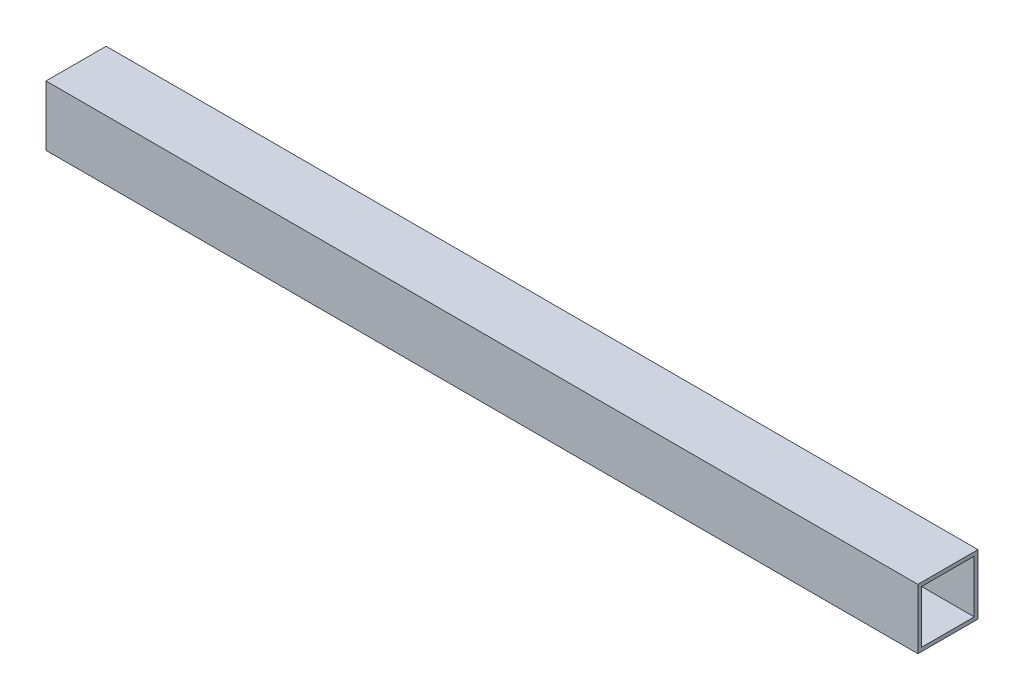
ISO-10303-21;
HEADER;
FILE_DESCRIPTION(('STEP AP214'),'2;1');
FILE_NAME('part.step','',(''),(''),'','','');
FILE_SCHEMA(('AUTOMOTIVE_DESIGN { 1 0 10303 214 1 1 1 1 }'));
ENDSEC;
DATA;
#1=APPLICATION_CONTEXT('core data for automotive mechanical design processes');
#2=APPLICATION_PROTOCOL_DEFINITION('international standard','automotive_design',2000,#1);
#3=PRODUCT_CONTEXT('',#1,'mechanical');
#4=PRODUCT('Part','Part','',(#3));
#5=PRODUCT_RELATED_PRODUCT_CATEGORY('part','',(#4));
#6=PRODUCT_DEFINITION_FORMATION('','',#4);
#7=PRODUCT_DEFINITION_CONTEXT('part definition',#1,'design');
#8=PRODUCT_DEFINITION('design','',#6,#7);
#9=PRODUCT_DEFINITION_SHAPE('','',#8);
#10=(LENGTH_UNIT() NAMED_UNIT(*) SI_UNIT(.MILLI.,.METRE.));
#11=(NAMED_UNIT(*) PLANE_ANGLE_UNIT() SI_UNIT($,.RADIAN.));
#12=(NAMED_UNIT(*) SI_UNIT($,.STERADIAN.) SOLID_ANGLE_UNIT());
#13=UNCERTAINTY_MEASURE_WITH_UNIT(LENGTH_MEASURE(1.E-05),#10,'distance_accuracy_value','');
#14=(GEOMETRIC_REPRESENTATION_CONTEXT(3) GLOBAL_UNCERTAINTY_ASSIGNED_CONTEXT((#13)) GLOBAL_UNIT_ASSIGNED_CONTEXT((#10,
#11,#12)) REPRESENTATION_CONTEXT('',''));
#15=CARTESIAN_POINT('',(0.,0.,0.));
#16=DIRECTION('',(0.,0.,1.));
#17=DIRECTION('',(1.,0.,0.));
#18=AXIS2_PLACEMENT_3D('',#15,#16,#17);
#19=CARTESIAN_POINT('',(368.3,0.,0.));
#20=DIRECTION('',(-1.,0.,0.));
#21=DIRECTION('',(0.,0.,1.));
#22=AXIS2_PLACEMENT_3D('',#19,#20,#21);
#23=PLANE('',#22);
#24=DIRECTION('',(0.,1.,0.));
#25=VECTOR('',#24,1.);
#26=CARTESIAN_POINT('',(368.3,-12.7,-12.7));
#27=LINE('',#26,#25);
#28=CARTESIAN_POINT('',(368.3,-12.7,-12.7));
#29=VERTEX_POINT('',#28);
#30=CARTESIAN_POINT('',(368.3,12.7,-12.7));
#31=VERTEX_POINT('',#30);
#32=EDGE_CURVE('E134',#29,#31,#27,.T.);
#33=ORIENTED_EDGE('',*,*,#32,.T.);
#34=DIRECTION('',(0.,0.,1.));
#35=VECTOR('',#34,1.);
#36=CARTESIAN_POINT('',(368.3,12.7,12.7));
#37=LINE('',#36,#35);
#38=CARTESIAN_POINT('',(368.3,12.7,12.7));
#39=VERTEX_POINT('',#38);
#40=EDGE_CURVE('E137',#31,#39,#37,.T.);
#41=ORIENTED_EDGE('',*,*,#40,.T.);
#42=DIRECTION('',(0.,-1.,0.));
#43=VECTOR('',#42,1.);
#44=CARTESIAN_POINT('',(368.3,-12.7,12.7));
#45=LINE('',#44,#43);
#46=CARTESIAN_POINT('',(368.3,-12.7,12.7));
#47=VERTEX_POINT('',#46);
#48=EDGE_CURVE('E140',#39,#47,#45,.T.);
#49=ORIENTED_EDGE('',*,*,#48,.T.);
#50=DIRECTION('',(0.,0.,-1.));
#51=VECTOR('',#50,1.);
#52=CARTESIAN_POINT('',(368.3,-12.7,12.7));
#53=LINE('',#52,#51);
#54=EDGE_CURVE('E142',#47,#29,#53,.T.);
#55=ORIENTED_EDGE('',*,*,#54,.T.);
#56=EDGE_LOOP('',(#33,#41,#49,#55));
#57=FACE_BOUND('',#56,.T.);
#58=DIRECTION('',(0.,1.,0.));
#59=VECTOR('',#58,1.);
#60=CARTESIAN_POINT('',(368.3,-11.1125,-11.1125));
#61=LINE('',#60,#59);
#62=CARTESIAN_POINT('',(368.3,-11.1125,-11.1125));
#63=VERTEX_POINT('',#62);
#64=CARTESIAN_POINT('',(368.3,11.1125,-11.1125));
#65=VERTEX_POINT('',#64);
#66=EDGE_CURVE('E98',#63,#65,#61,.T.);
#67=ORIENTED_EDGE('',*,*,#66,.F.);
#68=DIRECTION('',(0.,0.,-1.));
#69=VECTOR('',#68,1.);
#70=CARTESIAN_POINT('',(368.3,-11.1125,11.1125));
#71=LINE('',#70,#69);
#72=CARTESIAN_POINT('',(368.3,-11.1125,11.1125));
#73=VERTEX_POINT('',#72);
#74=EDGE_CURVE('E120',#73,#63,#71,.T.);
#75=ORIENTED_EDGE('',*,*,#74,.F.);
#76=DIRECTION('',(0.,-1.,0.));
#77=VECTOR('',#76,1.);
#78=CARTESIAN_POINT('',(368.3,-11.1125,11.1125));
#79=LINE('',#78,#77);
#80=CARTESIAN_POINT('',(368.3,11.1125,11.1125));
#81=VERTEX_POINT('',#80);
#82=EDGE_CURVE('E118',#81,#73,#79,.T.);
#83=ORIENTED_EDGE('',*,*,#82,.F.);
#84=DIRECTION('',(0.,0.,1.));
#85=VECTOR('',#84,1.);
#86=CARTESIAN_POINT('',(368.3,11.1125,11.1125));
#87=LINE('',#86,#85);
#88=EDGE_CURVE('E106',#65,#81,#87,.T.);
#89=ORIENTED_EDGE('',*,*,#88,.F.);
#90=EDGE_LOOP('',(#67,#75,#83,#89));
#91=FACE_BOUND('',#90,.T.);
#92=ADVANCED_FACE('F33',(#57,#91),#23,.F.);
#93=CARTESIAN_POINT('',(0.,0.,0.));
#94=DIRECTION('',(-1.,0.,0.));
#95=DIRECTION('',(0.,0.,1.));
#96=AXIS2_PLACEMENT_3D('',#93,#94,#95);
#97=PLANE('',#96);
#98=DIRECTION('',(0.,1.,0.));
#99=VECTOR('',#98,1.);
#100=CARTESIAN_POINT('',(0.,-12.7,-12.7));
#101=LINE('',#100,#99);
#102=CARTESIAN_POINT('',(0.,-12.7,-12.7));
#103=VERTEX_POINT('',#102);
#104=CARTESIAN_POINT('',(0.,12.7,-12.7));
#105=VERTEX_POINT('',#104);
#106=EDGE_CURVE('E114',#103,#105,#101,.T.);
#107=ORIENTED_EDGE('',*,*,#106,.F.);
#108=DIRECTION('',(0.,0.,-1.));
#109=VECTOR('',#108,1.);
#110=CARTESIAN_POINT('',(0.,-12.7,12.7));
#111=LINE('',#110,#109);
#112=CARTESIAN_POINT('',(0.,-12.7,12.7));
#113=VERTEX_POINT('',#112);
#114=EDGE_CURVE('E138',#113,#103,#111,.T.);
#115=ORIENTED_EDGE('',*,*,#114,.F.);
#116=DIRECTION('',(0.,-1.,0.));
#117=VECTOR('',#116,1.);
#118=CARTESIAN_POINT('',(0.,-12.7,12.7));
#119=LINE('',#118,#117);
#120=CARTESIAN_POINT('',(0.,12.7,12.7));
#121=VERTEX_POINT('',#120);
#122=EDGE_CURVE('E149',#121,#113,#119,.T.);
#123=ORIENTED_EDGE('',*,*,#122,.F.);
#124=DIRECTION('',(0.,0.,1.));
#125=VECTOR('',#124,1.);
#126=CARTESIAN_POINT('',(0.,12.7,12.7));
#127=LINE('',#126,#125);
#128=EDGE_CURVE('E147',#105,#121,#127,.T.);
#129=ORIENTED_EDGE('',*,*,#128,.F.);
#130=EDGE_LOOP('',(#107,#115,#123,#129));
#131=FACE_BOUND('',#130,.T.);
#132=DIRECTION('',(0.,0.,-1.));
#133=VECTOR('',#132,1.);
#134=CARTESIAN_POINT('',(0.,-11.1125,11.1125));
#135=LINE('',#134,#133);
#136=CARTESIAN_POINT('',(0.,-11.1125,11.1125));
#137=VERTEX_POINT('',#136);
#138=CARTESIAN_POINT('',(0.,-11.1125,-11.1125));
#139=VERTEX_POINT('',#138);
#140=EDGE_CURVE('E107',#137,#139,#135,.T.);
#141=ORIENTED_EDGE('',*,*,#140,.T.);
#142=DIRECTION('',(0.,1.,0.));
#143=VECTOR('',#142,1.);
#144=CARTESIAN_POINT('',(0.,-11.1125,-11.1125));
#145=LINE('',#144,#143);
#146=CARTESIAN_POINT('',(0.,11.1125,-11.1125));
#147=VERTEX_POINT('',#146);
#148=EDGE_CURVE('E56',#139,#147,#145,.T.);
#149=ORIENTED_EDGE('',*,*,#148,.T.);
#150=DIRECTION('',(0.,0.,1.));
#151=VECTOR('',#150,1.);
#152=CARTESIAN_POINT('',(0.,11.1125,11.1125));
#153=LINE('',#152,#151);
#154=CARTESIAN_POINT('',(0.,11.1125,11.1125));
#155=VERTEX_POINT('',#154);
#156=EDGE_CURVE('E113',#147,#155,#153,.T.);
#157=ORIENTED_EDGE('',*,*,#156,.T.);
#158=DIRECTION('',(0.,-1.,0.));
#159=VECTOR('',#158,1.);
#160=CARTESIAN_POINT('',(0.,-11.1125,11.1125));
#161=LINE('',#160,#159);
#162=EDGE_CURVE('E126',#155,#137,#161,.T.);
#163=ORIENTED_EDGE('',*,*,#162,.T.);
#164=EDGE_LOOP('',(#141,#149,#157,#163));
#165=FACE_BOUND('',#164,.T.);
#166=ADVANCED_FACE('F167',(#131,#165),#97,.T.);
#167=CARTESIAN_POINT('',(368.3,-12.7,-12.7));
#168=DIRECTION('',(0.,0.,1.));
#169=DIRECTION('',(1.,0.,0.));
#170=AXIS2_PLACEMENT_3D('',#167,#168,#169);
#171=PLANE('',#170);
#172=ORIENTED_EDGE('',*,*,#106,.T.);
#173=DIRECTION('',(-1.,0.,0.));
#174=VECTOR('',#173,1.);
#175=CARTESIAN_POINT('',(368.3,12.7,-12.7));
#176=LINE('',#175,#174);
#177=EDGE_CURVE('E11',#31,#105,#176,.T.);
#178=ORIENTED_EDGE('',*,*,#177,.F.);
#179=ORIENTED_EDGE('',*,*,#32,.F.);
#180=DIRECTION('',(-1.,0.,0.));
#181=VECTOR('',#180,1.);
#182=CARTESIAN_POINT('',(368.3,-12.7,-12.7));
#183=LINE('',#182,#181);
#184=EDGE_CURVE('E144',#29,#103,#183,.T.);
#185=ORIENTED_EDGE('',*,*,#184,.T.);
#186=EDGE_LOOP('',(#172,#178,#179,#185));
#187=FACE_BOUND('',#186,.T.);
#188=ADVANCED_FACE('F35',(#187),#171,.F.);
#189=CARTESIAN_POINT('',(368.3,12.7,12.7));
#190=DIRECTION('',(0.,-1.,0.));
#191=DIRECTION('',(0.,0.,-1.));
#192=AXIS2_PLACEMENT_3D('',#189,#190,#191);
#193=PLANE('',#192);
#194=ORIENTED_EDGE('',*,*,#128,.T.);
#195=DIRECTION('',(-1.,0.,0.));
#196=VECTOR('',#195,1.);
#197=CARTESIAN_POINT('',(368.3,12.7,12.7));
#198=LINE('',#197,#196);
#199=EDGE_CURVE('E41',#39,#121,#198,.T.);
#200=ORIENTED_EDGE('',*,*,#199,.F.);
#201=ORIENTED_EDGE('',*,*,#40,.F.);
#202=ORIENTED_EDGE('',*,*,#177,.T.);
#203=EDGE_LOOP('',(#194,#200,#201,#202));
#204=FACE_BOUND('',#203,.T.);
#205=ADVANCED_FACE('F177',(#204),#193,.F.);
#206=CARTESIAN_POINT('',(368.3,-12.7,12.7));
#207=DIRECTION('',(0.,0.,-1.));
#208=DIRECTION('',(-1.,0.,0.));
#209=AXIS2_PLACEMENT_3D('',#206,#207,#208);
#210=PLANE('',#209);
#211=ORIENTED_EDGE('',*,*,#122,.T.);
#212=DIRECTION('',(-1.,0.,0.));
#213=VECTOR('',#212,1.);
#214=CARTESIAN_POINT('',(368.3,-12.7,12.7));
#215=LINE('',#214,#213);
#216=EDGE_CURVE('E154',#47,#113,#215,.T.);
#217=ORIENTED_EDGE('',*,*,#216,.F.);
#218=ORIENTED_EDGE('',*,*,#48,.F.);
#219=ORIENTED_EDGE('',*,*,#199,.T.);
#220=EDGE_LOOP('',(#211,#217,#218,#219));
#221=FACE_BOUND('',#220,.T.);
#222=ADVANCED_FACE('F161',(#221),#210,.F.);
#223=CARTESIAN_POINT('',(368.3,-12.7,12.7));
#224=DIRECTION('',(0.,1.,0.));
#225=DIRECTION('',(0.,0.,1.));
#226=AXIS2_PLACEMENT_3D('',#223,#224,#225);
#227=PLANE('',#226);
#228=ORIENTED_EDGE('',*,*,#114,.T.);
#229=ORIENTED_EDGE('',*,*,#184,.F.);
#230=ORIENTED_EDGE('',*,*,#54,.F.);
#231=ORIENTED_EDGE('',*,*,#216,.T.);
#232=EDGE_LOOP('',(#228,#229,#230,#231));
#233=FACE_BOUND('',#232,.T.);
#234=ADVANCED_FACE('F171',(#233),#227,.F.);
#235=CARTESIAN_POINT('',(368.3,-11.1125,-11.1125));
#236=DIRECTION('',(0.,0.,1.));
#237=DIRECTION('',(1.,0.,0.));
#238=AXIS2_PLACEMENT_3D('',#235,#236,#237);
#239=PLANE('',#238);
#240=ORIENTED_EDGE('',*,*,#148,.F.);
#241=DIRECTION('',(-1.,0.,0.));
#242=VECTOR('',#241,1.);
#243=CARTESIAN_POINT('',(368.3,-11.1125,-11.1125));
#244=LINE('',#243,#242);
#245=EDGE_CURVE('E102',#63,#139,#244,.T.);
#246=ORIENTED_EDGE('',*,*,#245,.F.);
#247=ORIENTED_EDGE('',*,*,#66,.T.);
#248=DIRECTION('',(-1.,0.,0.));
#249=VECTOR('',#248,1.);
#250=CARTESIAN_POINT('',(368.3,11.1125,-11.1125));
#251=LINE('',#250,#249);
#252=EDGE_CURVE('E101',#65,#147,#251,.T.);
#253=ORIENTED_EDGE('',*,*,#252,.T.);
#254=EDGE_LOOP('',(#240,#246,#247,#253));
#255=FACE_BOUND('',#254,.T.);
#256=ADVANCED_FACE('F100',(#255),#239,.T.);
#257=CARTESIAN_POINT('',(368.3,11.1125,11.1125));
#258=DIRECTION('',(0.,-1.,0.));
#259=DIRECTION('',(0.,0.,-1.));
#260=AXIS2_PLACEMENT_3D('',#257,#258,#259);
#261=PLANE('',#260);
#262=ORIENTED_EDGE('',*,*,#156,.F.);
#263=ORIENTED_EDGE('',*,*,#252,.F.);
#264=ORIENTED_EDGE('',*,*,#88,.T.);
#265=DIRECTION('',(-1.,0.,0.));
#266=VECTOR('',#265,1.);
#267=CARTESIAN_POINT('',(368.3,11.1125,11.1125));
#268=LINE('',#267,#266);
#269=EDGE_CURVE('E115',#81,#155,#268,.T.);
#270=ORIENTED_EDGE('',*,*,#269,.T.);
#271=EDGE_LOOP('',(#262,#263,#264,#270));
#272=FACE_BOUND('',#271,.T.);
#273=ADVANCED_FACE('F110',(#272),#261,.T.);
#274=CARTESIAN_POINT('',(368.3,-11.1125,11.1125));
#275=DIRECTION('',(0.,0.,-1.));
#276=DIRECTION('',(-1.,0.,0.));
#277=AXIS2_PLACEMENT_3D('',#274,#275,#276);
#278=PLANE('',#277);
#279=ORIENTED_EDGE('',*,*,#162,.F.);
#280=ORIENTED_EDGE('',*,*,#269,.F.);
#281=ORIENTED_EDGE('',*,*,#82,.T.);
#282=DIRECTION('',(-1.,0.,0.));
#283=VECTOR('',#282,1.);
#284=CARTESIAN_POINT('',(368.3,-11.1125,11.1125));
#285=LINE('',#284,#283);
#286=EDGE_CURVE('E48',#73,#137,#285,.T.);
#287=ORIENTED_EDGE('',*,*,#286,.T.);
#288=EDGE_LOOP('',(#279,#280,#281,#287));
#289=FACE_BOUND('',#288,.T.);
#290=ADVANCED_FACE('F200',(#289),#278,.T.);
#291=CARTESIAN_POINT('',(368.3,-11.1125,11.1125));
#292=DIRECTION('',(0.,1.,0.));
#293=DIRECTION('',(0.,0.,1.));
#294=AXIS2_PLACEMENT_3D('',#291,#292,#293);
#295=PLANE('',#294);
#296=ORIENTED_EDGE('',*,*,#140,.F.);
#297=ORIENTED_EDGE('',*,*,#286,.F.);
#298=ORIENTED_EDGE('',*,*,#74,.T.);
#299=ORIENTED_EDGE('',*,*,#245,.T.);
#300=EDGE_LOOP('',(#296,#297,#298,#299));
#301=FACE_BOUND('',#300,.T.);
#302=ADVANCED_FACE('F204',(#301),#295,.T.);
#303=CLOSED_SHELL('',(#92,#166,#188,#205,#222,#234,#256,#273,#290,#302));
#304=MANIFOLD_SOLID_BREP('B2',#303);
#305=ADVANCED_BREP_SHAPE_REPRESENTATION('',(#18,#304),#14);
#306=SHAPE_DEFINITION_REPRESENTATION(#9,#305);
ENDSEC;
END-ISO-10303-21;
